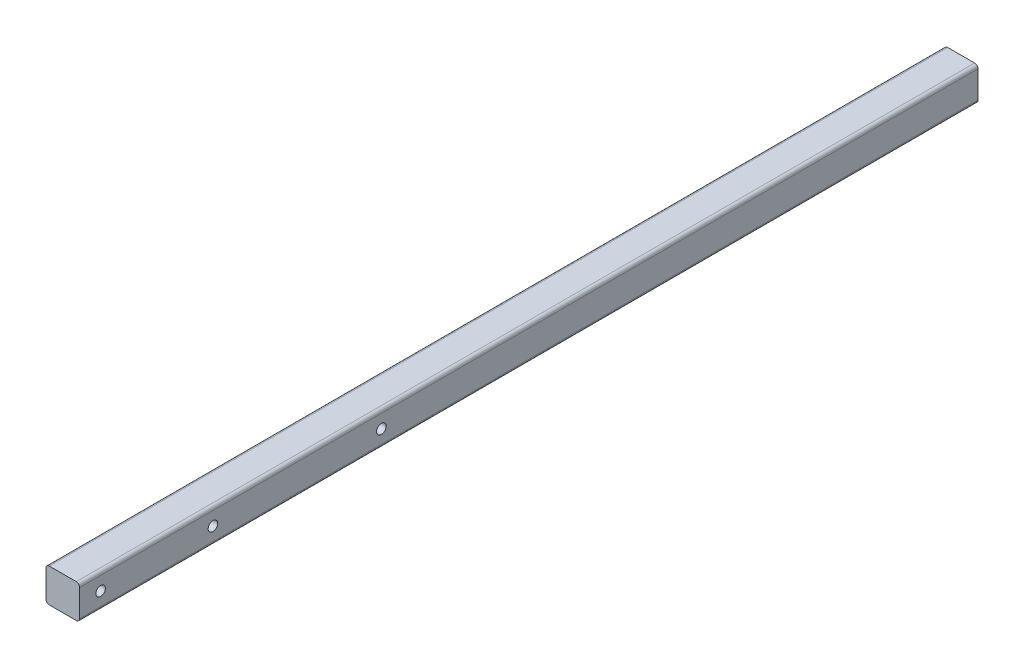
ISO-10303-21;
HEADER;
FILE_DESCRIPTION(('STEP AP214'),'2;1');
FILE_NAME('part.step','',(''),(''),'','','');
FILE_SCHEMA(('AUTOMOTIVE_DESIGN { 1 0 10303 214 1 1 1 1 }'));
ENDSEC;
DATA;
#1=APPLICATION_CONTEXT('core data for automotive mechanical design processes');
#2=APPLICATION_PROTOCOL_DEFINITION('international standard','automotive_design',2000,#1);
#3=PRODUCT_CONTEXT('',#1,'mechanical');
#4=PRODUCT('Part','Part','',(#3));
#5=PRODUCT_RELATED_PRODUCT_CATEGORY('part','',(#4));
#6=PRODUCT_DEFINITION_FORMATION('','',#4);
#7=PRODUCT_DEFINITION_CONTEXT('part definition',#1,'design');
#8=PRODUCT_DEFINITION('design','',#6,#7);
#9=PRODUCT_DEFINITION_SHAPE('','',#8);
#10=(LENGTH_UNIT() NAMED_UNIT(*) SI_UNIT(.MILLI.,.METRE.));
#11=(NAMED_UNIT(*) PLANE_ANGLE_UNIT() SI_UNIT($,.RADIAN.));
#12=(NAMED_UNIT(*) SI_UNIT($,.STERADIAN.) SOLID_ANGLE_UNIT());
#13=UNCERTAINTY_MEASURE_WITH_UNIT(LENGTH_MEASURE(1.E-05),#10,'distance_accuracy_value','');
#14=(GEOMETRIC_REPRESENTATION_CONTEXT(3) GLOBAL_UNCERTAINTY_ASSIGNED_CONTEXT((#13)) GLOBAL_UNIT_ASSIGNED_CONTEXT((#10,
#11,#12)) REPRESENTATION_CONTEXT('',''));
#15=CARTESIAN_POINT('',(0.,0.,0.));
#16=DIRECTION('',(0.,0.,1.));
#17=DIRECTION('',(1.,0.,0.));
#18=AXIS2_PLACEMENT_3D('',#15,#16,#17);
#19=CARTESIAN_POINT('',(-314.1,537.880996201166,259.753768994929));
#20=DIRECTION('',(0.,1.,0.));
#21=DIRECTION('',(0.,0.,1.));
#22=AXIS2_PLACEMENT_3D('',#19,#20,#21);
#23=PLANE('',#22);
#24=DIRECTION('',(1.,0.,0.));
#25=VECTOR('',#24,1.);
#26=CARTESIAN_POINT('',(-314.1,537.880996201166,259.753768994929));
#27=LINE('',#26,#25);
#28=CARTESIAN_POINT('',(-311.1,537.880996201166,259.753768994929));
#29=VERTEX_POINT('',#28);
#30=CARTESIAN_POINT('',(-287.1,537.880996201166,259.753768994929));
#31=VERTEX_POINT('',#30);
#32=EDGE_CURVE('E126',#29,#31,#27,.T.);
#33=ORIENTED_EDGE('',*,*,#32,.F.);
#34=DIRECTION('',(0.,0.,1.));
#35=VECTOR('',#34,1.);
#36=CARTESIAN_POINT('',(-311.1,537.880996201166,1059.75376899493));
#37=LINE('',#36,#35);
#38=CARTESIAN_POINT('',(-311.1,537.880996201166,1059.75376899493));
#39=VERTEX_POINT('',#38);
#40=EDGE_CURVE('E11',#29,#39,#37,.T.);
#41=ORIENTED_EDGE('',*,*,#40,.T.);
#42=DIRECTION('',(1.,0.,0.));
#43=VECTOR('',#42,1.);
#44=CARTESIAN_POINT('',(-314.1,537.880996201166,1059.75376899493));
#45=LINE('',#44,#43);
#46=CARTESIAN_POINT('',(-287.1,537.880996201166,1059.75376899493));
#47=VERTEX_POINT('',#46);
#48=EDGE_CURVE('E156',#39,#47,#45,.T.);
#49=ORIENTED_EDGE('',*,*,#48,.T.);
#50=DIRECTION('',(0.,0.,1.));
#51=VECTOR('',#50,1.);
#52=CARTESIAN_POINT('',(-287.1,537.880996201166,259.753768994929));
#53=LINE('',#52,#51);
#54=EDGE_CURVE('E48',#47,#31,#53,.F.);
#55=ORIENTED_EDGE('',*,*,#54,.T.);
#56=EDGE_LOOP('',(#33,#41,#49,#55));
#57=FACE_BOUND('',#56,.T.);
#58=ADVANCED_FACE('F39',(#57),#23,.T.);
#59=CARTESIAN_POINT('',(-314.1,507.880996201166,259.753768994929));
#60=DIRECTION('',(0.,0.,-1.));
#61=DIRECTION('',(0.,1.,0.));
#62=AXIS2_PLACEMENT_3D('',#59,#60,#61);
#63=PLANE('',#62);
#64=DIRECTION('',(0.,1.,0.));
#65=VECTOR('',#64,1.);
#66=CARTESIAN_POINT('',(-284.1,507.880996201166,259.753768994929));
#67=LINE('',#66,#65);
#68=CARTESIAN_POINT('',(-284.1,510.880996201166,259.753768994929));
#69=VERTEX_POINT('',#68);
#70=CARTESIAN_POINT('',(-284.1,534.880996201166,259.753768994929));
#71=VERTEX_POINT('',#70);
#72=EDGE_CURVE('E123',#69,#71,#67,.T.);
#73=ORIENTED_EDGE('',*,*,#72,.F.);
#74=CARTESIAN_POINT('',(-287.1,510.880996201166,259.753768994929));
#75=DIRECTION('',(0.,0.,-1.));
#76=DIRECTION('',(0.,1.,0.));
#77=AXIS2_PLACEMENT_3D('',#74,#75,#76);
#78=CIRCLE('',#77,3.00000000000015);
#79=CARTESIAN_POINT('',(-287.1,507.880996201166,259.753768994929));
#80=VERTEX_POINT('',#79);
#81=EDGE_CURVE('E170',#69,#80,#78,.T.);
#82=ORIENTED_EDGE('',*,*,#81,.T.);
#83=DIRECTION('',(1.,0.,0.));
#84=VECTOR('',#83,1.);
#85=CARTESIAN_POINT('',(-314.1,507.880996201166,259.753768994929));
#86=LINE('',#85,#84);
#87=CARTESIAN_POINT('',(-311.1,507.880996201166,259.753768994929));
#88=VERTEX_POINT('',#87);
#89=EDGE_CURVE('E149',#88,#80,#86,.T.);
#90=ORIENTED_EDGE('',*,*,#89,.F.);
#91=CARTESIAN_POINT('',(-311.1,510.880996201166,259.753768994929));
#92=DIRECTION('',(0.,0.,-1.));
#93=DIRECTION('',(0.,1.,0.));
#94=AXIS2_PLACEMENT_3D('',#91,#92,#93);
#95=CIRCLE('',#94,3.00000000000015);
#96=CARTESIAN_POINT('',(-314.1,510.880996201166,259.753768994929));
#97=VERTEX_POINT('',#96);
#98=EDGE_CURVE('E167',#88,#97,#95,.T.);
#99=ORIENTED_EDGE('',*,*,#98,.T.);
#100=DIRECTION('',(0.,1.,0.));
#101=VECTOR('',#100,1.);
#102=CARTESIAN_POINT('',(-314.1,507.880996201166,259.753768994929));
#103=LINE('',#102,#101);
#104=CARTESIAN_POINT('',(-314.1,534.880996201166,259.753768994929));
#105=VERTEX_POINT('',#104);
#106=EDGE_CURVE('E143',#97,#105,#103,.T.);
#107=ORIENTED_EDGE('',*,*,#106,.T.);
#108=CARTESIAN_POINT('',(-311.1,534.880996201166,259.753768994929));
#109=DIRECTION('',(0.,0.,-1.));
#110=DIRECTION('',(0.,1.,0.));
#111=AXIS2_PLACEMENT_3D('',#108,#109,#110);
#112=CIRCLE('',#111,3.00000000000015);
#113=EDGE_CURVE('E164',#105,#29,#112,.T.);
#114=ORIENTED_EDGE('',*,*,#113,.T.);
#115=ORIENTED_EDGE('',*,*,#32,.T.);
#116=CARTESIAN_POINT('',(-287.1,534.880996201166,259.753768994929));
#117=DIRECTION('',(0.,0.,-1.));
#118=DIRECTION('',(0.,1.,0.));
#119=AXIS2_PLACEMENT_3D('',#116,#117,#118);
#120=CIRCLE('',#119,3.00000000000015);
#121=EDGE_CURVE('E161',#31,#71,#120,.T.);
#122=ORIENTED_EDGE('',*,*,#121,.T.);
#123=EDGE_LOOP('',(#73,#82,#90,#99,#107,#114,#115,#122));
#124=FACE_BOUND('',#123,.T.);
#125=ADVANCED_FACE('F195',(#124),#63,.T.);
#126=CARTESIAN_POINT('',(-314.1,507.880996201166,1059.75376899493));
#127=DIRECTION('',(0.,-1.,0.));
#128=DIRECTION('',(0.,0.,-1.));
#129=AXIS2_PLACEMENT_3D('',#126,#127,#128);
#130=PLANE('',#129);
#131=ORIENTED_EDGE('',*,*,#89,.T.);
#132=DIRECTION('',(0.,0.,-1.));
#133=VECTOR('',#132,1.);
#134=CARTESIAN_POINT('',(-287.1,507.880996201166,1059.75376899493));
#135=LINE('',#134,#133);
#136=CARTESIAN_POINT('',(-287.1,507.880996201166,1059.75376899493));
#137=VERTEX_POINT('',#136);
#138=EDGE_CURVE('E113',#80,#137,#135,.F.);
#139=ORIENTED_EDGE('',*,*,#138,.T.);
#140=DIRECTION('',(1.,0.,0.));
#141=VECTOR('',#140,1.);
#142=CARTESIAN_POINT('',(-314.1,507.880996201166,1059.75376899493));
#143=LINE('',#142,#141);
#144=CARTESIAN_POINT('',(-311.1,507.880996201166,1059.75376899493));
#145=VERTEX_POINT('',#144);
#146=EDGE_CURVE('E153',#145,#137,#143,.T.);
#147=ORIENTED_EDGE('',*,*,#146,.F.);
#148=DIRECTION('',(0.,0.,-1.));
#149=VECTOR('',#148,1.);
#150=CARTESIAN_POINT('',(-311.1,507.880996201166,259.753768994929));
#151=LINE('',#150,#149);
#152=EDGE_CURVE('E173',#145,#88,#151,.T.);
#153=ORIENTED_EDGE('',*,*,#152,.T.);
#154=EDGE_LOOP('',(#131,#139,#147,#153));
#155=FACE_BOUND('',#154,.T.);
#156=ADVANCED_FACE('F252',(#155),#130,.T.);
#157=CARTESIAN_POINT('',(-314.1,537.880996201166,1059.75376899493));
#158=DIRECTION('',(0.,0.,1.));
#159=DIRECTION('',(1.,0.,0.));
#160=AXIS2_PLACEMENT_3D('',#157,#158,#159);
#161=PLANE('',#160);
#162=ORIENTED_EDGE('',*,*,#146,.T.);
#163=CARTESIAN_POINT('',(-287.1,510.880996201166,1059.75376899493));
#164=DIRECTION('',(0.,0.,1.));
#165=DIRECTION('',(1.,0.,0.));
#166=AXIS2_PLACEMENT_3D('',#163,#164,#165);
#167=CIRCLE('',#166,3.00000000000015);
#168=CARTESIAN_POINT('',(-284.1,510.880996201166,1059.75376899493));
#169=VERTEX_POINT('',#168);
#170=EDGE_CURVE('E131',#137,#169,#167,.T.);
#171=ORIENTED_EDGE('',*,*,#170,.T.);
#172=DIRECTION('',(0.,-1.,0.));
#173=VECTOR('',#172,1.);
#174=CARTESIAN_POINT('',(-284.1,537.880996201166,1059.75376899493));
#175=LINE('',#174,#173);
#176=CARTESIAN_POINT('',(-284.1,534.880996201166,1059.75376899493));
#177=VERTEX_POINT('',#176);
#178=EDGE_CURVE('E120',#177,#169,#175,.T.);
#179=ORIENTED_EDGE('',*,*,#178,.F.);
#180=CARTESIAN_POINT('',(-287.1,534.880996201166,1059.75376899493));
#181=DIRECTION('',(0.,0.,1.));
#182=DIRECTION('',(1.,0.,0.));
#183=AXIS2_PLACEMENT_3D('',#180,#181,#182);
#184=CIRCLE('',#183,3.00000000000015);
#185=EDGE_CURVE('E106',#177,#47,#184,.T.);
#186=ORIENTED_EDGE('',*,*,#185,.T.);
#187=ORIENTED_EDGE('',*,*,#48,.F.);
#188=CARTESIAN_POINT('',(-311.1,534.880996201166,1059.75376899493));
#189=DIRECTION('',(0.,0.,1.));
#190=DIRECTION('',(1.,0.,0.));
#191=AXIS2_PLACEMENT_3D('',#188,#189,#190);
#192=CIRCLE('',#191,3.00000000000015);
#193=CARTESIAN_POINT('',(-314.1,534.880996201166,1059.75376899493));
#194=VERTEX_POINT('',#193);
#195=EDGE_CURVE('E62',#39,#194,#192,.T.);
#196=ORIENTED_EDGE('',*,*,#195,.T.);
#197=DIRECTION('',(0.,-1.,0.));
#198=VECTOR('',#197,1.);
#199=CARTESIAN_POINT('',(-314.1,537.880996201166,1059.75376899493));
#200=LINE('',#199,#198);
#201=CARTESIAN_POINT('',(-314.1,510.880996201166,1059.75376899493));
#202=VERTEX_POINT('',#201);
#203=EDGE_CURVE('E137',#194,#202,#200,.T.);
#204=ORIENTED_EDGE('',*,*,#203,.T.);
#205=CARTESIAN_POINT('',(-311.1,510.880996201166,1059.75376899493));
#206=DIRECTION('',(0.,0.,1.));
#207=DIRECTION('',(1.,0.,0.));
#208=AXIS2_PLACEMENT_3D('',#205,#206,#207);
#209=CIRCLE('',#208,3.00000000000015);
#210=EDGE_CURVE('E181',#202,#145,#209,.T.);
#211=ORIENTED_EDGE('',*,*,#210,.T.);
#212=EDGE_LOOP('',(#162,#171,#179,#186,#187,#196,#204,#211));
#213=FACE_BOUND('',#212,.T.);
#214=ADVANCED_FACE('F129',(#213),#161,.T.);
#215=CARTESIAN_POINT('',(-314.1,0.,0.));
#216=DIRECTION('',(1.,0.,0.));
#217=DIRECTION('',(0.,0.,-1.));
#218=AXIS2_PLACEMENT_3D('',#215,#216,#217);
#219=PLANE('',#218);
#220=CARTESIAN_POINT('',(-314.1,522.880996201166,791.091669842818));
#221=DIRECTION('',(1.,0.,0.));
#222=DIRECTION('',(0.,0.,-1.));
#223=AXIS2_PLACEMENT_3D('',#220,#221,#222);
#224=CIRCLE('',#223,4.25000000000042);
#225=CARTESIAN_POINT('',(-314.1,522.880996201166,786.841669842817));
#226=VERTEX_POINT('',#225);
#227=EDGE_CURVE('E217',#226,#226,#224,.T.);
#228=ORIENTED_EDGE('',*,*,#227,.T.);
#229=EDGE_LOOP('',(#228));
#230=FACE_BOUND('',#229,.T.);
#231=CARTESIAN_POINT('',(-314.1,522.880996201166,941.091669842818));
#232=DIRECTION('',(1.,0.,0.));
#233=DIRECTION('',(0.,0.,-1.));
#234=AXIS2_PLACEMENT_3D('',#231,#232,#233);
#235=CIRCLE('',#234,4.25000000000042);
#236=CARTESIAN_POINT('',(-314.1,522.880996201166,936.841669842817));
#237=VERTEX_POINT('',#236);
#238=EDGE_CURVE('E209',#237,#237,#235,.T.);
#239=ORIENTED_EDGE('',*,*,#238,.T.);
#240=EDGE_LOOP('',(#239));
#241=FACE_BOUND('',#240,.T.);
#242=CARTESIAN_POINT('',(-314.1,522.880996201166,1041.09166984282));
#243=DIRECTION('',(1.,0.,0.));
#244=DIRECTION('',(0.,0.,-1.));
#245=AXIS2_PLACEMENT_3D('',#242,#243,#244);
#246=CIRCLE('',#245,4.25000000000042);
#247=CARTESIAN_POINT('',(-314.1,522.880996201166,1036.84166984282));
#248=VERTEX_POINT('',#247);
#249=EDGE_CURVE('E133',#248,#248,#246,.T.);
#250=ORIENTED_EDGE('',*,*,#249,.T.);
#251=EDGE_LOOP('',(#250));
#252=FACE_BOUND('',#251,.T.);
#253=ORIENTED_EDGE('',*,*,#106,.F.);
#254=DIRECTION('',(0.,0.,-1.));
#255=VECTOR('',#254,1.);
#256=CARTESIAN_POINT('',(-314.1,510.880996201166,1059.75376899493));
#257=LINE('',#256,#255);
#258=EDGE_CURVE('E55',#97,#202,#257,.F.);
#259=ORIENTED_EDGE('',*,*,#258,.T.);
#260=ORIENTED_EDGE('',*,*,#203,.F.);
#261=DIRECTION('',(0.,0.,1.));
#262=VECTOR('',#261,1.);
#263=CARTESIAN_POINT('',(-314.1,534.880996201166,259.753768994929));
#264=LINE('',#263,#262);
#265=EDGE_CURVE('E186',#194,#105,#264,.F.);
#266=ORIENTED_EDGE('',*,*,#265,.T.);
#267=EDGE_LOOP('',(#253,#259,#260,#266));
#268=FACE_BOUND('',#267,.T.);
#269=ADVANCED_FACE('F201',(#230,#241,#252,#268),#219,.F.);
#270=CARTESIAN_POINT('',(-284.1,0.,0.));
#271=DIRECTION('',(1.,0.,0.));
#272=DIRECTION('',(0.,0.,-1.));
#273=AXIS2_PLACEMENT_3D('',#270,#271,#272);
#274=PLANE('',#273);
#275=CARTESIAN_POINT('',(-284.1,522.880996201166,791.091669842818));
#276=DIRECTION('',(1.,0.,0.));
#277=DIRECTION('',(0.,0.,-1.));
#278=AXIS2_PLACEMENT_3D('',#275,#276,#277);
#279=CIRCLE('',#278,4.25000000000042);
#280=CARTESIAN_POINT('',(-284.1,522.880996201166,786.841669842817));
#281=VERTEX_POINT('',#280);
#282=EDGE_CURVE('E221',#281,#281,#279,.T.);
#283=ORIENTED_EDGE('',*,*,#282,.F.);
#284=EDGE_LOOP('',(#283));
#285=FACE_BOUND('',#284,.T.);
#286=CARTESIAN_POINT('',(-284.1,522.880996201166,941.091669842818));
#287=DIRECTION('',(1.,0.,0.));
#288=DIRECTION('',(0.,0.,-1.));
#289=AXIS2_PLACEMENT_3D('',#286,#287,#288);
#290=CIRCLE('',#289,4.25000000000042);
#291=CARTESIAN_POINT('',(-284.1,522.880996201166,936.841669842817));
#292=VERTEX_POINT('',#291);
#293=EDGE_CURVE('E213',#292,#292,#290,.T.);
#294=ORIENTED_EDGE('',*,*,#293,.F.);
#295=EDGE_LOOP('',(#294));
#296=FACE_BOUND('',#295,.T.);
#297=CARTESIAN_POINT('',(-284.1,522.880996201166,1041.09166984282));
#298=DIRECTION('',(1.,0.,0.));
#299=DIRECTION('',(0.,0.,-1.));
#300=AXIS2_PLACEMENT_3D('',#297,#298,#299);
#301=CIRCLE('',#300,4.25000000000042);
#302=CARTESIAN_POINT('',(-284.1,522.880996201166,1036.84166984282));
#303=VERTEX_POINT('',#302);
#304=EDGE_CURVE('E140',#303,#303,#301,.T.);
#305=ORIENTED_EDGE('',*,*,#304,.F.);
#306=EDGE_LOOP('',(#305));
#307=FACE_BOUND('',#306,.T.);
#308=ORIENTED_EDGE('',*,*,#178,.T.);
#309=DIRECTION('',(0.,0.,-1.));
#310=VECTOR('',#309,1.);
#311=CARTESIAN_POINT('',(-284.1,510.880996201166,0.));
#312=LINE('',#311,#310);
#313=EDGE_CURVE('E125',#169,#69,#312,.T.);
#314=ORIENTED_EDGE('',*,*,#313,.T.);
#315=ORIENTED_EDGE('',*,*,#72,.T.);
#316=DIRECTION('',(0.,0.,1.));
#317=VECTOR('',#316,1.);
#318=CARTESIAN_POINT('',(-284.1,534.880996201166,0.));
#319=LINE('',#318,#317);
#320=EDGE_CURVE('E109',#71,#177,#319,.T.);
#321=ORIENTED_EDGE('',*,*,#320,.T.);
#322=EDGE_LOOP('',(#308,#314,#315,#321));
#323=FACE_BOUND('',#322,.T.);
#324=ADVANCED_FACE('F118',(#285,#296,#307,#323),#274,.T.);
#325=CARTESIAN_POINT('',(-284.1,522.880996201166,1041.09166984282));
#326=DIRECTION('',(1.,0.,0.));
#327=DIRECTION('',(0.,0.,-1.));
#328=AXIS2_PLACEMENT_3D('',#325,#326,#327);
#329=CYLINDRICAL_SURFACE('',#328,4.25000000000042);
#330=ORIENTED_EDGE('',*,*,#249,.F.);
#331=EDGE_LOOP('',(#330));
#332=FACE_BOUND('',#331,.T.);
#333=ORIENTED_EDGE('',*,*,#304,.T.);
#334=EDGE_LOOP('',(#333));
#335=FACE_BOUND('',#334,.T.);
#336=ADVANCED_FACE('F230',(#332,#335),#329,.F.);
#337=CARTESIAN_POINT('',(-284.1,522.880996201166,941.091669842818));
#338=DIRECTION('',(1.,0.,0.));
#339=DIRECTION('',(0.,0.,-1.));
#340=AXIS2_PLACEMENT_3D('',#337,#338,#339);
#341=CYLINDRICAL_SURFACE('',#340,4.25000000000042);
#342=ORIENTED_EDGE('',*,*,#238,.F.);
#343=EDGE_LOOP('',(#342));
#344=FACE_BOUND('',#343,.T.);
#345=ORIENTED_EDGE('',*,*,#293,.T.);
#346=EDGE_LOOP('',(#345));
#347=FACE_BOUND('',#346,.T.);
#348=ADVANCED_FACE('F237',(#344,#347),#341,.F.);
#349=CARTESIAN_POINT('',(-284.1,522.880996201166,791.091669842818));
#350=DIRECTION('',(1.,0.,0.));
#351=DIRECTION('',(0.,0.,-1.));
#352=AXIS2_PLACEMENT_3D('',#349,#350,#351);
#353=CYLINDRICAL_SURFACE('',#352,4.25000000000042);
#354=ORIENTED_EDGE('',*,*,#227,.F.);
#355=EDGE_LOOP('',(#354));
#356=FACE_BOUND('',#355,.T.);
#357=ORIENTED_EDGE('',*,*,#282,.T.);
#358=EDGE_LOOP('',(#357));
#359=FACE_BOUND('',#358,.T.);
#360=ADVANCED_FACE('F226',(#356,#359),#353,.F.);
#361=CARTESIAN_POINT('',(-287.1,510.880996201166,0.));
#362=DIRECTION('',(0.,0.,-1.));
#363=DIRECTION('',(-1.,0.,0.));
#364=AXIS2_PLACEMENT_3D('',#361,#362,#363);
#365=CYLINDRICAL_SURFACE('',#364,3.00000000000015);
#366=ORIENTED_EDGE('',*,*,#170,.F.);
#367=ORIENTED_EDGE('',*,*,#138,.F.);
#368=ORIENTED_EDGE('',*,*,#81,.F.);
#369=ORIENTED_EDGE('',*,*,#313,.F.);
#370=EDGE_LOOP('',(#366,#367,#368,#369));
#371=FACE_BOUND('',#370,.T.);
#372=ADVANCED_FACE('F257',(#371),#365,.T.);
#373=CARTESIAN_POINT('',(-311.1,510.880996201166,1059.75376899493));
#374=DIRECTION('',(0.,0.,1.));
#375=DIRECTION('',(1.,0.,0.));
#376=AXIS2_PLACEMENT_3D('',#373,#374,#375);
#377=CYLINDRICAL_SURFACE('',#376,3.00000000000015);
#378=ORIENTED_EDGE('',*,*,#210,.F.);
#379=ORIENTED_EDGE('',*,*,#258,.F.);
#380=ORIENTED_EDGE('',*,*,#98,.F.);
#381=ORIENTED_EDGE('',*,*,#152,.F.);
#382=EDGE_LOOP('',(#378,#379,#380,#381));
#383=FACE_BOUND('',#382,.T.);
#384=ADVANCED_FACE('F260',(#383),#377,.T.);
#385=CARTESIAN_POINT('',(-311.1,534.880996201166,259.753768994929));
#386=DIRECTION('',(0.,0.,-1.));
#387=DIRECTION('',(0.,1.,0.));
#388=AXIS2_PLACEMENT_3D('',#385,#386,#387);
#389=CYLINDRICAL_SURFACE('',#388,3.00000000000015);
#390=ORIENTED_EDGE('',*,*,#113,.F.);
#391=ORIENTED_EDGE('',*,*,#265,.F.);
#392=ORIENTED_EDGE('',*,*,#195,.F.);
#393=ORIENTED_EDGE('',*,*,#40,.F.);
#394=EDGE_LOOP('',(#390,#391,#392,#393));
#395=FACE_BOUND('',#394,.T.);
#396=ADVANCED_FACE('F200',(#395),#389,.T.);
#397=CARTESIAN_POINT('',(-287.1,534.880996201166,0.));
#398=DIRECTION('',(0.,0.,1.));
#399=DIRECTION('',(0.,-1.,0.));
#400=AXIS2_PLACEMENT_3D('',#397,#398,#399);
#401=CYLINDRICAL_SURFACE('',#400,3.00000000000015);
#402=ORIENTED_EDGE('',*,*,#121,.F.);
#403=ORIENTED_EDGE('',*,*,#54,.F.);
#404=ORIENTED_EDGE('',*,*,#185,.F.);
#405=ORIENTED_EDGE('',*,*,#320,.F.);
#406=EDGE_LOOP('',(#402,#403,#404,#405));
#407=FACE_BOUND('',#406,.T.);
#408=ADVANCED_FACE('F41',(#407),#401,.T.);
#409=CLOSED_SHELL('',(#58,#125,#156,#214,#269,#324,#336,#348,#360,#372,#384,#396,#408));
#410=MANIFOLD_SOLID_BREP('B2',#409);
#411=ADVANCED_BREP_SHAPE_REPRESENTATION('',(#18,#410),#14);
#412=SHAPE_DEFINITION_REPRESENTATION(#9,#411);
ENDSEC;
END-ISO-10303-21;
